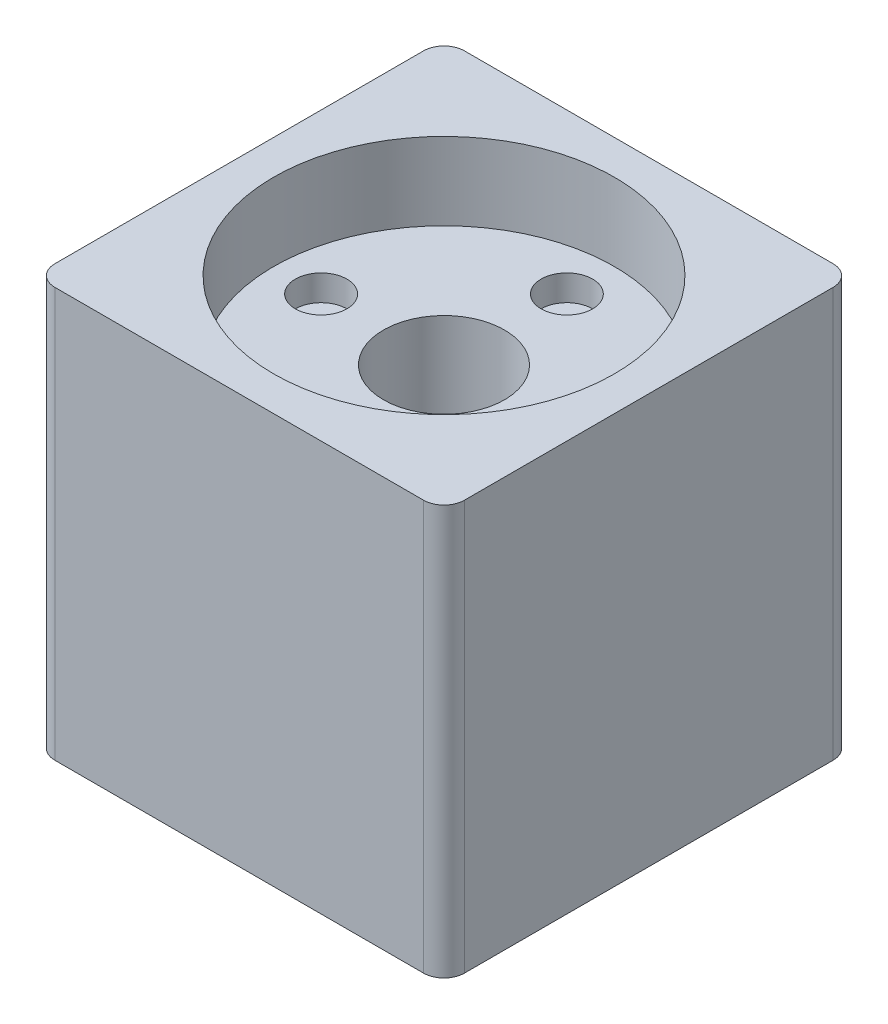
ISO-10303-21;
HEADER;
FILE_DESCRIPTION(('STEP AP214'),'2;1');
FILE_NAME('part.step','',(''),(''),'','','');
FILE_SCHEMA(('AUTOMOTIVE_DESIGN { 1 0 10303 214 1 1 1 1 }'));
ENDSEC;
DATA;
#1=APPLICATION_CONTEXT('core data for automotive mechanical design processes');
#2=APPLICATION_PROTOCOL_DEFINITION('international standard','automotive_design',2000,#1);
#3=PRODUCT_CONTEXT('',#1,'mechanical');
#4=PRODUCT('Part','Part','',(#3));
#5=PRODUCT_RELATED_PRODUCT_CATEGORY('part','',(#4));
#6=PRODUCT_DEFINITION_FORMATION('','',#4);
#7=PRODUCT_DEFINITION_CONTEXT('part definition',#1,'design');
#8=PRODUCT_DEFINITION('design','',#6,#7);
#9=PRODUCT_DEFINITION_SHAPE('','',#8);
#10=(LENGTH_UNIT() NAMED_UNIT(*) SI_UNIT(.MILLI.,.METRE.));
#11=(NAMED_UNIT(*) PLANE_ANGLE_UNIT() SI_UNIT($,.RADIAN.));
#12=(NAMED_UNIT(*) SI_UNIT($,.STERADIAN.) SOLID_ANGLE_UNIT());
#13=UNCERTAINTY_MEASURE_WITH_UNIT(LENGTH_MEASURE(1.E-05),#10,'distance_accuracy_value','');
#14=(GEOMETRIC_REPRESENTATION_CONTEXT(3) GLOBAL_UNCERTAINTY_ASSIGNED_CONTEXT((#13)) GLOBAL_UNIT_ASSIGNED_CONTEXT((#10,
#11,#12)) REPRESENTATION_CONTEXT('',''));
#15=CARTESIAN_POINT('',(0.,0.,0.));
#16=DIRECTION('',(0.,0.,1.));
#17=DIRECTION('',(1.,0.,0.));
#18=AXIS2_PLACEMENT_3D('',#15,#16,#17);
#19=CARTESIAN_POINT('',(0.,7.9375,0.));
#20=DIRECTION('',(0.,-1.,0.));
#21=DIRECTION('',(0.,0.,-1.));
#22=AXIS2_PLACEMENT_3D('',#19,#20,#21);
#23=CYLINDRICAL_SURFACE('',#22,2.34506403026729);
#24=CARTESIAN_POINT('',(0.,-7.9375,0.));
#25=DIRECTION('',(0.,1.,0.));
#26=DIRECTION('',(0.,0.,1.));
#27=AXIS2_PLACEMENT_3D('',#24,#25,#26);
#28=CIRCLE('',#27,2.34506403026729);
#29=CARTESIAN_POINT('',(0.,-7.9375,2.34506403026729));
#30=VERTEX_POINT('',#29);
#31=EDGE_CURVE('E126',#30,#30,#28,.T.);
#32=ORIENTED_EDGE('',*,*,#31,.F.);
#33=EDGE_LOOP('',(#32));
#34=FACE_BOUND('',#33,.T.);
#35=CARTESIAN_POINT('',(0.,4.9375,0.));
#36=DIRECTION('',(0.,1.,0.));
#37=DIRECTION('',(0.,0.,1.));
#38=AXIS2_PLACEMENT_3D('',#35,#36,#37);
#39=CIRCLE('',#38,2.34506403026729);
#40=CARTESIAN_POINT('',(0.,4.9375,2.34506403026729));
#41=VERTEX_POINT('',#40);
#42=EDGE_CURVE('E132',#41,#41,#39,.T.);
#43=ORIENTED_EDGE('',*,*,#42,.T.);
#44=EDGE_LOOP('',(#43));
#45=FACE_BOUND('',#44,.T.);
#46=ADVANCED_FACE('F33',(#34,#45),#23,.F.);
#47=CARTESIAN_POINT('',(0.,7.9375,0.));
#48=DIRECTION('',(0.,-1.,0.));
#49=DIRECTION('',(0.,0.,-1.));
#50=AXIS2_PLACEMENT_3D('',#47,#48,#49);
#51=PLANE('',#50);
#52=CARTESIAN_POINT('',(0.,7.9375,0.));
#53=DIRECTION('',(0.,1.,0.));
#54=DIRECTION('',(0.,0.,1.));
#55=AXIS2_PLACEMENT_3D('',#52,#53,#54);
#56=CIRCLE('',#55,6.604);
#57=CARTESIAN_POINT('',(0.,7.9375,6.604));
#58=VERTEX_POINT('',#57);
#59=EDGE_CURVE('E181',#58,#58,#56,.T.);
#60=ORIENTED_EDGE('',*,*,#59,.F.);
#61=EDGE_LOOP('',(#60));
#62=FACE_BOUND('',#61,.T.);
#63=DIRECTION('',(1.,0.,0.));
#64=VECTOR('',#63,1.);
#65=CARTESIAN_POINT('',(-7.9375,7.9375,7.9375));
#66=LINE('',#65,#64);
#67=CARTESIAN_POINT('',(-7.14375,7.9375,7.9375));
#68=VERTEX_POINT('',#67);
#69=CARTESIAN_POINT('',(7.14375,7.9375,7.9375));
#70=VERTEX_POINT('',#69);
#71=EDGE_CURVE('E135',#68,#70,#66,.T.);
#72=ORIENTED_EDGE('',*,*,#71,.T.);
#73=CARTESIAN_POINT('',(7.14375,7.9375,7.14375));
#74=DIRECTION('',(0.,-1.,0.));
#75=DIRECTION('',(0.,0.,-1.));
#76=AXIS2_PLACEMENT_3D('',#73,#74,#75);
#77=CIRCLE('',#76,0.79375);
#78=CARTESIAN_POINT('',(7.9375,7.9375,7.14375));
#79=VERTEX_POINT('',#78);
#80=EDGE_CURVE('E157',#70,#79,#77,.F.);
#81=ORIENTED_EDGE('',*,*,#80,.T.);
#82=DIRECTION('',(0.,0.,-1.));
#83=VECTOR('',#82,1.);
#84=CARTESIAN_POINT('',(7.9375,7.9375,7.9375));
#85=LINE('',#84,#83);
#86=CARTESIAN_POINT('',(7.9375,7.9375,-7.14375));
#87=VERTEX_POINT('',#86);
#88=EDGE_CURVE('E118',#79,#87,#85,.T.);
#89=ORIENTED_EDGE('',*,*,#88,.T.);
#90=CARTESIAN_POINT('',(7.14375,7.9375,-7.14375));
#91=DIRECTION('',(0.,-1.,0.));
#92=DIRECTION('',(0.,0.,-1.));
#93=AXIS2_PLACEMENT_3D('',#90,#91,#92);
#94=CIRCLE('',#93,0.79375);
#95=CARTESIAN_POINT('',(7.14375,7.9375,-7.9375));
#96=VERTEX_POINT('',#95);
#97=EDGE_CURVE('E155',#87,#96,#94,.F.);
#98=ORIENTED_EDGE('',*,*,#97,.T.);
#99=DIRECTION('',(-1.,0.,0.));
#100=VECTOR('',#99,1.);
#101=CARTESIAN_POINT('',(-7.9375,7.9375,-7.9375));
#102=LINE('',#101,#100);
#103=CARTESIAN_POINT('',(-7.14375,7.9375,-7.9375));
#104=VERTEX_POINT('',#103);
#105=EDGE_CURVE('E177',#96,#104,#102,.T.);
#106=ORIENTED_EDGE('',*,*,#105,.T.);
#107=CARTESIAN_POINT('',(-7.14375,7.9375,-7.14375));
#108=DIRECTION('',(0.,-1.,0.));
#109=DIRECTION('',(0.,0.,-1.));
#110=AXIS2_PLACEMENT_3D('',#107,#108,#109);
#111=CIRCLE('',#110,0.79375);
#112=CARTESIAN_POINT('',(-7.9375,7.9375,-7.14375));
#113=VERTEX_POINT('',#112);
#114=EDGE_CURVE('E53',#104,#113,#111,.F.);
#115=ORIENTED_EDGE('',*,*,#114,.T.);
#116=DIRECTION('',(0.,0.,1.));
#117=VECTOR('',#116,1.);
#118=CARTESIAN_POINT('',(-7.9375,7.9375,7.9375));
#119=LINE('',#118,#117);
#120=CARTESIAN_POINT('',(-7.9375,7.9375,7.14375));
#121=VERTEX_POINT('',#120);
#122=EDGE_CURVE('E167',#113,#121,#119,.T.);
#123=ORIENTED_EDGE('',*,*,#122,.T.);
#124=CARTESIAN_POINT('',(-7.14375,7.9375,7.14375));
#125=DIRECTION('',(0.,-1.,0.));
#126=DIRECTION('',(0.,0.,-1.));
#127=AXIS2_PLACEMENT_3D('',#124,#125,#126);
#128=CIRCLE('',#127,0.79375);
#129=EDGE_CURVE('E153',#121,#68,#128,.F.);
#130=ORIENTED_EDGE('',*,*,#129,.T.);
#131=EDGE_LOOP('',(#72,#81,#89,#98,#106,#115,#123,#130));
#132=FACE_BOUND('',#131,.T.);
#133=ADVANCED_FACE('F241',(#62,#132),#51,.F.);
#134=CARTESIAN_POINT('',(0.,-7.9375,0.));
#135=DIRECTION('',(0.,-1.,0.));
#136=DIRECTION('',(0.,0.,-1.));
#137=AXIS2_PLACEMENT_3D('',#134,#135,#136);
#138=PLANE('',#137);
#139=DIRECTION('',(0.,0.,-1.));
#140=VECTOR('',#139,1.);
#141=CARTESIAN_POINT('',(7.9375,-7.9375,7.9375));
#142=LINE('',#141,#140);
#143=CARTESIAN_POINT('',(7.9375,-7.9375,7.14375));
#144=VERTEX_POINT('',#143);
#145=CARTESIAN_POINT('',(7.9375,-7.9375,-7.14375));
#146=VERTEX_POINT('',#145);
#147=EDGE_CURVE('E115',#144,#146,#142,.T.);
#148=ORIENTED_EDGE('',*,*,#147,.F.);
#149=CARTESIAN_POINT('',(7.14375,-7.9375,7.14375));
#150=DIRECTION('',(0.,-1.,0.));
#151=DIRECTION('',(0.,0.,-1.));
#152=AXIS2_PLACEMENT_3D('',#149,#150,#151);
#153=CIRCLE('',#152,0.79375);
#154=CARTESIAN_POINT('',(7.14375,-7.9375,7.9375));
#155=VERTEX_POINT('',#154);
#156=EDGE_CURVE('E98',#144,#155,#153,.T.);
#157=ORIENTED_EDGE('',*,*,#156,.T.);
#158=DIRECTION('',(1.,0.,0.));
#159=VECTOR('',#158,1.);
#160=CARTESIAN_POINT('',(-7.9375,-7.9375,7.9375));
#161=LINE('',#160,#159);
#162=CARTESIAN_POINT('',(-7.14375,-7.9375,7.9375));
#163=VERTEX_POINT('',#162);
#164=EDGE_CURVE('E139',#163,#155,#161,.T.);
#165=ORIENTED_EDGE('',*,*,#164,.F.);
#166=CARTESIAN_POINT('',(-7.14375,-7.9375,7.14375));
#167=DIRECTION('',(0.,-1.,0.));
#168=DIRECTION('',(0.,0.,-1.));
#169=AXIS2_PLACEMENT_3D('',#166,#167,#168);
#170=CIRCLE('',#169,0.79375);
#171=CARTESIAN_POINT('',(-7.9375,-7.9375,7.14375));
#172=VERTEX_POINT('',#171);
#173=EDGE_CURVE('E146',#163,#172,#170,.T.);
#174=ORIENTED_EDGE('',*,*,#173,.T.);
#175=DIRECTION('',(0.,0.,1.));
#176=VECTOR('',#175,1.);
#177=CARTESIAN_POINT('',(-7.9375,-7.9375,7.9375));
#178=LINE('',#177,#176);
#179=CARTESIAN_POINT('',(-7.9375,-7.9375,-7.14375));
#180=VERTEX_POINT('',#179);
#181=EDGE_CURVE('E129',#180,#172,#178,.T.);
#182=ORIENTED_EDGE('',*,*,#181,.F.);
#183=CARTESIAN_POINT('',(-7.14375,-7.9375,-7.14375));
#184=DIRECTION('',(0.,-1.,0.));
#185=DIRECTION('',(0.,0.,-1.));
#186=AXIS2_PLACEMENT_3D('',#183,#184,#185);
#187=CIRCLE('',#186,0.79375);
#188=CARTESIAN_POINT('',(-7.14375,-7.9375,-7.9375));
#189=VERTEX_POINT('',#188);
#190=EDGE_CURVE('E119',#180,#189,#187,.T.);
#191=ORIENTED_EDGE('',*,*,#190,.T.);
#192=DIRECTION('',(-1.,0.,0.));
#193=VECTOR('',#192,1.);
#194=CARTESIAN_POINT('',(-7.9375,-7.9375,-7.9375));
#195=LINE('',#194,#193);
#196=CARTESIAN_POINT('',(7.14375,-7.9375,-7.9375));
#197=VERTEX_POINT('',#196);
#198=EDGE_CURVE('E125',#197,#189,#195,.T.);
#199=ORIENTED_EDGE('',*,*,#198,.F.);
#200=CARTESIAN_POINT('',(7.14375,-7.9375,-7.14375));
#201=DIRECTION('',(0.,-1.,0.));
#202=DIRECTION('',(0.,0.,-1.));
#203=AXIS2_PLACEMENT_3D('',#200,#201,#202);
#204=CIRCLE('',#203,0.79375);
#205=EDGE_CURVE('E109',#197,#146,#204,.T.);
#206=ORIENTED_EDGE('',*,*,#205,.T.);
#207=EDGE_LOOP('',(#148,#157,#165,#174,#182,#191,#199,#206));
#208=FACE_BOUND('',#207,.T.);
#209=ORIENTED_EDGE('',*,*,#31,.T.);
#210=EDGE_LOOP('',(#209));
#211=FACE_BOUND('',#210,.T.);
#212=ADVANCED_FACE('F122',(#208,#211),#138,.T.);
#213=CARTESIAN_POINT('',(7.9375,7.9375,7.9375));
#214=DIRECTION('',(-1.,0.,0.));
#215=DIRECTION('',(0.,0.,1.));
#216=AXIS2_PLACEMENT_3D('',#213,#214,#215);
#217=PLANE('',#216);
#218=ORIENTED_EDGE('',*,*,#88,.F.);
#219=DIRECTION('',(0.,-1.,0.));
#220=VECTOR('',#219,1.);
#221=CARTESIAN_POINT('',(7.9375,7.9375,7.14375));
#222=LINE('',#221,#220);
#223=EDGE_CURVE('E102',#79,#144,#222,.T.);
#224=ORIENTED_EDGE('',*,*,#223,.T.);
#225=ORIENTED_EDGE('',*,*,#147,.T.);
#226=DIRECTION('',(0.,-1.,0.));
#227=VECTOR('',#226,1.);
#228=CARTESIAN_POINT('',(7.9375,7.9375,-7.14375));
#229=LINE('',#228,#227);
#230=EDGE_CURVE('E120',#146,#87,#229,.F.);
#231=ORIENTED_EDGE('',*,*,#230,.T.);
#232=EDGE_LOOP('',(#218,#224,#225,#231));
#233=FACE_BOUND('',#232,.T.);
#234=ADVANCED_FACE('F114',(#233),#217,.F.);
#235=CARTESIAN_POINT('',(-7.9375,7.9375,-7.9375));
#236=DIRECTION('',(0.,0.,1.));
#237=DIRECTION('',(1.,0.,0.));
#238=AXIS2_PLACEMENT_3D('',#235,#236,#237);
#239=PLANE('',#238);
#240=ORIENTED_EDGE('',*,*,#105,.F.);
#241=DIRECTION('',(0.,-1.,0.));
#242=VECTOR('',#241,1.);
#243=CARTESIAN_POINT('',(7.14375,7.9375,-7.9375));
#244=LINE('',#243,#242);
#245=EDGE_CURVE('E161',#96,#197,#244,.T.);
#246=ORIENTED_EDGE('',*,*,#245,.T.);
#247=ORIENTED_EDGE('',*,*,#198,.T.);
#248=DIRECTION('',(0.,-1.,0.));
#249=VECTOR('',#248,1.);
#250=CARTESIAN_POINT('',(-7.14375,7.9375,-7.9375));
#251=LINE('',#250,#249);
#252=EDGE_CURVE('E159',#189,#104,#251,.F.);
#253=ORIENTED_EDGE('',*,*,#252,.T.);
#254=EDGE_LOOP('',(#240,#246,#247,#253));
#255=FACE_BOUND('',#254,.T.);
#256=ADVANCED_FACE('F256',(#255),#239,.F.);
#257=CARTESIAN_POINT('',(-7.9375,7.9375,7.9375));
#258=DIRECTION('',(1.,0.,0.));
#259=DIRECTION('',(0.,0.,-1.));
#260=AXIS2_PLACEMENT_3D('',#257,#258,#259);
#261=PLANE('',#260);
#262=ORIENTED_EDGE('',*,*,#181,.T.);
#263=DIRECTION('',(0.,-1.,0.));
#264=VECTOR('',#263,1.);
#265=CARTESIAN_POINT('',(-7.9375,7.9375,7.14375));
#266=LINE('',#265,#264);
#267=EDGE_CURVE('E11',#172,#121,#266,.F.);
#268=ORIENTED_EDGE('',*,*,#267,.T.);
#269=ORIENTED_EDGE('',*,*,#122,.F.);
#270=DIRECTION('',(0.,-1.,0.));
#271=VECTOR('',#270,1.);
#272=CARTESIAN_POINT('',(-7.9375,7.9375,-7.14375));
#273=LINE('',#272,#271);
#274=EDGE_CURVE('E41',#113,#180,#273,.T.);
#275=ORIENTED_EDGE('',*,*,#274,.T.);
#276=EDGE_LOOP('',(#262,#268,#269,#275));
#277=FACE_BOUND('',#276,.T.);
#278=ADVANCED_FACE('F166',(#277),#261,.F.);
#279=CARTESIAN_POINT('',(-7.9375,7.9375,7.9375));
#280=DIRECTION('',(0.,0.,-1.));
#281=DIRECTION('',(-1.,0.,0.));
#282=AXIS2_PLACEMENT_3D('',#279,#280,#281);
#283=PLANE('',#282);
#284=ORIENTED_EDGE('',*,*,#164,.T.);
#285=DIRECTION('',(0.,-1.,0.));
#286=VECTOR('',#285,1.);
#287=CARTESIAN_POINT('',(7.14375,7.9375,7.9375));
#288=LINE('',#287,#286);
#289=EDGE_CURVE('E103',#155,#70,#288,.F.);
#290=ORIENTED_EDGE('',*,*,#289,.T.);
#291=ORIENTED_EDGE('',*,*,#71,.F.);
#292=DIRECTION('',(0.,-1.,0.));
#293=VECTOR('',#292,1.);
#294=CARTESIAN_POINT('',(-7.14375,7.9375,7.9375));
#295=LINE('',#294,#293);
#296=EDGE_CURVE('E108',#68,#163,#295,.T.);
#297=ORIENTED_EDGE('',*,*,#296,.T.);
#298=EDGE_LOOP('',(#284,#290,#291,#297));
#299=FACE_BOUND('',#298,.T.);
#300=ADVANCED_FACE('F175',(#299),#283,.F.);
#301=CARTESIAN_POINT('',(0.,4.9375,0.));
#302=DIRECTION('',(0.,1.,0.));
#303=DIRECTION('',(0.,0.,1.));
#304=AXIS2_PLACEMENT_3D('',#301,#302,#303);
#305=CYLINDRICAL_SURFACE('',#304,6.604);
#306=CARTESIAN_POINT('',(0.,4.9375,0.));
#307=DIRECTION('',(0.,1.,0.));
#308=DIRECTION('',(0.,0.,1.));
#309=AXIS2_PLACEMENT_3D('',#306,#307,#308);
#310=CIRCLE('',#309,6.604);
#311=CARTESIAN_POINT('',(0.,4.9375,6.604));
#312=VERTEX_POINT('',#311);
#313=EDGE_CURVE('E143',#312,#312,#310,.T.);
#314=ORIENTED_EDGE('',*,*,#313,.F.);
#315=EDGE_LOOP('',(#314));
#316=FACE_BOUND('',#315,.T.);
#317=ORIENTED_EDGE('',*,*,#59,.T.);
#318=EDGE_LOOP('',(#317));
#319=FACE_BOUND('',#318,.T.);
#320=ADVANCED_FACE('F224',(#316,#319),#305,.F.);
#321=CARTESIAN_POINT('',(0.,4.9375,0.));
#322=DIRECTION('',(0.,1.,0.));
#323=DIRECTION('',(0.,0.,1.));
#324=AXIS2_PLACEMENT_3D('',#321,#322,#323);
#325=PLANE('',#324);
#326=CARTESIAN_POINT('',(0.,4.9375,4.7625));
#327=DIRECTION('',(0.,1.,0.));
#328=DIRECTION('',(1.,0.,0.));
#329=AXIS2_PLACEMENT_3D('',#326,#327,#328);
#330=CIRCLE('',#329,1.);
#331=CARTESIAN_POINT('',(1.00000000000002,4.9375,4.7625));
#332=VERTEX_POINT('',#331);
#333=EDGE_CURVE('E205',#332,#332,#330,.T.);
#334=ORIENTED_EDGE('',*,*,#333,.F.);
#335=EDGE_LOOP('',(#334));
#336=FACE_BOUND('',#335,.T.);
#337=CARTESIAN_POINT('',(4.7625,4.9375,0.));
#338=DIRECTION('',(0.,1.,0.));
#339=DIRECTION('',(0.,0.,-1.));
#340=AXIS2_PLACEMENT_3D('',#337,#338,#339);
#341=CIRCLE('',#340,1.);
#342=CARTESIAN_POINT('',(4.7625,4.9375,-1.));
#343=VERTEX_POINT('',#342);
#344=EDGE_CURVE('E199',#343,#343,#341,.T.);
#345=ORIENTED_EDGE('',*,*,#344,.F.);
#346=EDGE_LOOP('',(#345));
#347=FACE_BOUND('',#346,.T.);
#348=CARTESIAN_POINT('',(0.,4.9375,-4.7625));
#349=DIRECTION('',(0.,1.,0.));
#350=DIRECTION('',(-1.,0.,0.));
#351=AXIS2_PLACEMENT_3D('',#348,#349,#350);
#352=CIRCLE('',#351,1.);
#353=CARTESIAN_POINT('',(-1.00000000000005,4.9375,-4.76249999999999));
#354=VERTEX_POINT('',#353);
#355=EDGE_CURVE('E193',#354,#354,#352,.T.);
#356=ORIENTED_EDGE('',*,*,#355,.F.);
#357=EDGE_LOOP('',(#356));
#358=FACE_BOUND('',#357,.T.);
#359=CARTESIAN_POINT('',(-4.7625,4.9375,0.));
#360=DIRECTION('',(0.,1.,0.));
#361=DIRECTION('',(0.,0.,1.));
#362=AXIS2_PLACEMENT_3D('',#359,#360,#361);
#363=CIRCLE('',#362,1.);
#364=CARTESIAN_POINT('',(-4.7625,4.9375,1.));
#365=VERTEX_POINT('',#364);
#366=EDGE_CURVE('E187',#365,#365,#363,.T.);
#367=ORIENTED_EDGE('',*,*,#366,.F.);
#368=EDGE_LOOP('',(#367));
#369=FACE_BOUND('',#368,.T.);
#370=ORIENTED_EDGE('',*,*,#42,.F.);
#371=EDGE_LOOP('',(#370));
#372=FACE_BOUND('',#371,.T.);
#373=ORIENTED_EDGE('',*,*,#313,.T.);
#374=EDGE_LOOP('',(#373));
#375=FACE_BOUND('',#374,.T.);
#376=ADVANCED_FACE('F220',(#336,#347,#358,#369,#372,#375),#325,.T.);
#377=CARTESIAN_POINT('',(-4.7625,3.9375,0.));
#378=DIRECTION('',(0.,1.,0.));
#379=DIRECTION('',(0.,0.,1.));
#380=AXIS2_PLACEMENT_3D('',#377,#378,#379);
#381=CYLINDRICAL_SURFACE('',#380,1.);
#382=CARTESIAN_POINT('',(-4.7625,3.9375,0.));
#383=DIRECTION('',(0.,1.,0.));
#384=DIRECTION('',(0.,0.,1.));
#385=AXIS2_PLACEMENT_3D('',#382,#383,#384);
#386=CIRCLE('',#385,1.);
#387=CARTESIAN_POINT('',(-4.7625,3.9375,1.));
#388=VERTEX_POINT('',#387);
#389=EDGE_CURVE('E184',#388,#388,#386,.T.);
#390=ORIENTED_EDGE('',*,*,#389,.F.);
#391=EDGE_LOOP('',(#390));
#392=FACE_BOUND('',#391,.T.);
#393=ORIENTED_EDGE('',*,*,#366,.T.);
#394=EDGE_LOOP('',(#393));
#395=FACE_BOUND('',#394,.T.);
#396=ADVANCED_FACE('F223',(#392,#395),#381,.F.);
#397=CARTESIAN_POINT('',(-4.7625,3.9375,0.));
#398=DIRECTION('',(0.,1.,0.));
#399=DIRECTION('',(0.,0.,1.));
#400=AXIS2_PLACEMENT_3D('',#397,#398,#399);
#401=PLANE('',#400);
#402=ORIENTED_EDGE('',*,*,#389,.T.);
#403=EDGE_LOOP('',(#402));
#404=FACE_BOUND('',#403,.T.);
#405=ADVANCED_FACE('F265',(#404),#401,.T.);
#406=CARTESIAN_POINT('',(7.14375,7.9375,7.14375));
#407=DIRECTION('',(0.,-1.,0.));
#408=DIRECTION('',(0.,0.,-1.));
#409=AXIS2_PLACEMENT_3D('',#406,#407,#408);
#410=CYLINDRICAL_SURFACE('',#409,0.79375);
#411=ORIENTED_EDGE('',*,*,#80,.F.);
#412=ORIENTED_EDGE('',*,*,#289,.F.);
#413=ORIENTED_EDGE('',*,*,#156,.F.);
#414=ORIENTED_EDGE('',*,*,#223,.F.);
#415=EDGE_LOOP('',(#411,#412,#413,#414));
#416=FACE_BOUND('',#415,.T.);
#417=ADVANCED_FACE('F101',(#416),#410,.T.);
#418=CARTESIAN_POINT('',(7.14375,7.9375,-7.14375));
#419=DIRECTION('',(0.,-1.,0.));
#420=DIRECTION('',(0.,0.,-1.));
#421=AXIS2_PLACEMENT_3D('',#418,#419,#420);
#422=CYLINDRICAL_SURFACE('',#421,0.79375);
#423=ORIENTED_EDGE('',*,*,#97,.F.);
#424=ORIENTED_EDGE('',*,*,#230,.F.);
#425=ORIENTED_EDGE('',*,*,#205,.F.);
#426=ORIENTED_EDGE('',*,*,#245,.F.);
#427=EDGE_LOOP('',(#423,#424,#425,#426));
#428=FACE_BOUND('',#427,.T.);
#429=ADVANCED_FACE('F264',(#428),#422,.T.);
#430=CARTESIAN_POINT('',(-7.14375,7.9375,7.14375));
#431=DIRECTION('',(0.,-1.,0.));
#432=DIRECTION('',(0.,0.,-1.));
#433=AXIS2_PLACEMENT_3D('',#430,#431,#432);
#434=CYLINDRICAL_SURFACE('',#433,0.79375);
#435=ORIENTED_EDGE('',*,*,#129,.F.);
#436=ORIENTED_EDGE('',*,*,#267,.F.);
#437=ORIENTED_EDGE('',*,*,#173,.F.);
#438=ORIENTED_EDGE('',*,*,#296,.F.);
#439=EDGE_LOOP('',(#435,#436,#437,#438));
#440=FACE_BOUND('',#439,.T.);
#441=ADVANCED_FACE('F172',(#440),#434,.T.);
#442=CARTESIAN_POINT('',(-7.14375,7.9375,-7.14375));
#443=DIRECTION('',(0.,-1.,0.));
#444=DIRECTION('',(0.,0.,-1.));
#445=AXIS2_PLACEMENT_3D('',#442,#443,#444);
#446=CYLINDRICAL_SURFACE('',#445,0.79375);
#447=ORIENTED_EDGE('',*,*,#114,.F.);
#448=ORIENTED_EDGE('',*,*,#252,.F.);
#449=ORIENTED_EDGE('',*,*,#190,.F.);
#450=ORIENTED_EDGE('',*,*,#274,.F.);
#451=EDGE_LOOP('',(#447,#448,#449,#450));
#452=FACE_BOUND('',#451,.T.);
#453=ADVANCED_FACE('F35',(#452),#446,.T.);
#454=CARTESIAN_POINT('',(0.,3.9375,-4.7625));
#455=DIRECTION('',(0.,1.,0.));
#456=DIRECTION('',(0.,0.,1.));
#457=AXIS2_PLACEMENT_3D('',#454,#455,#456);
#458=CYLINDRICAL_SURFACE('',#457,1.);
#459=CARTESIAN_POINT('',(0.,3.9375,-4.7625));
#460=DIRECTION('',(0.,1.,0.));
#461=DIRECTION('',(-1.,0.,0.));
#462=AXIS2_PLACEMENT_3D('',#459,#460,#461);
#463=CIRCLE('',#462,1.);
#464=CARTESIAN_POINT('',(-1.00000000000005,3.9375,-4.76249999999999));
#465=VERTEX_POINT('',#464);
#466=EDGE_CURVE('E196',#465,#465,#463,.T.);
#467=ORIENTED_EDGE('',*,*,#466,.F.);
#468=EDGE_LOOP('',(#467));
#469=FACE_BOUND('',#468,.T.);
#470=ORIENTED_EDGE('',*,*,#355,.T.);
#471=EDGE_LOOP('',(#470));
#472=FACE_BOUND('',#471,.T.);
#473=ADVANCED_FACE('F272',(#469,#472),#458,.F.);
#474=CARTESIAN_POINT('',(0.,3.9375,-4.7625));
#475=DIRECTION('',(0.,1.,0.));
#476=DIRECTION('',(-1.,0.,0.));
#477=AXIS2_PLACEMENT_3D('',#474,#475,#476);
#478=PLANE('',#477);
#479=ORIENTED_EDGE('',*,*,#466,.T.);
#480=EDGE_LOOP('',(#479));
#481=FACE_BOUND('',#480,.T.);
#482=ADVANCED_FACE('F276',(#481),#478,.T.);
#483=CARTESIAN_POINT('',(4.7625,3.9375,0.));
#484=DIRECTION('',(0.,1.,0.));
#485=DIRECTION('',(0.,0.,1.));
#486=AXIS2_PLACEMENT_3D('',#483,#484,#485);
#487=CYLINDRICAL_SURFACE('',#486,1.);
#488=CARTESIAN_POINT('',(4.7625,3.9375,0.));
#489=DIRECTION('',(0.,1.,0.));
#490=DIRECTION('',(0.,0.,-1.));
#491=AXIS2_PLACEMENT_3D('',#488,#489,#490);
#492=CIRCLE('',#491,1.);
#493=CARTESIAN_POINT('',(4.7625,3.9375,-1.));
#494=VERTEX_POINT('',#493);
#495=EDGE_CURVE('E202',#494,#494,#492,.T.);
#496=ORIENTED_EDGE('',*,*,#495,.F.);
#497=EDGE_LOOP('',(#496));
#498=FACE_BOUND('',#497,.T.);
#499=ORIENTED_EDGE('',*,*,#344,.T.);
#500=EDGE_LOOP('',(#499));
#501=FACE_BOUND('',#500,.T.);
#502=ADVANCED_FACE('F286',(#498,#501),#487,.F.);
#503=CARTESIAN_POINT('',(4.7625,3.9375,0.));
#504=DIRECTION('',(0.,1.,0.));
#505=DIRECTION('',(0.,0.,-1.));
#506=AXIS2_PLACEMENT_3D('',#503,#504,#505);
#507=PLANE('',#506);
#508=ORIENTED_EDGE('',*,*,#495,.T.);
#509=EDGE_LOOP('',(#508));
#510=FACE_BOUND('',#509,.T.);
#511=ADVANCED_FACE('F216',(#510),#507,.T.);
#512=CARTESIAN_POINT('',(0.,3.9375,4.7625));
#513=DIRECTION('',(0.,1.,0.));
#514=DIRECTION('',(0.,0.,1.));
#515=AXIS2_PLACEMENT_3D('',#512,#513,#514);
#516=CYLINDRICAL_SURFACE('',#515,1.);
#517=CARTESIAN_POINT('',(0.,3.9375,4.7625));
#518=DIRECTION('',(0.,1.,0.));
#519=DIRECTION('',(1.,0.,0.));
#520=AXIS2_PLACEMENT_3D('',#517,#518,#519);
#521=CIRCLE('',#520,1.);
#522=CARTESIAN_POINT('',(1.00000000000002,3.9375,4.7625));
#523=VERTEX_POINT('',#522);
#524=EDGE_CURVE('E190',#523,#523,#521,.T.);
#525=ORIENTED_EDGE('',*,*,#524,.F.);
#526=EDGE_LOOP('',(#525));
#527=FACE_BOUND('',#526,.T.);
#528=ORIENTED_EDGE('',*,*,#333,.T.);
#529=EDGE_LOOP('',(#528));
#530=FACE_BOUND('',#529,.T.);
#531=ADVANCED_FACE('F213',(#527,#530),#516,.F.);
#532=CARTESIAN_POINT('',(0.,3.9375,4.7625));
#533=DIRECTION('',(0.,1.,0.));
#534=DIRECTION('',(1.,0.,0.));
#535=AXIS2_PLACEMENT_3D('',#532,#533,#534);
#536=PLANE('',#535);
#537=ORIENTED_EDGE('',*,*,#524,.T.);
#538=EDGE_LOOP('',(#537));
#539=FACE_BOUND('',#538,.T.);
#540=ADVANCED_FACE('F211',(#539),#536,.T.);
#541=CLOSED_SHELL('',(#46,#133,#212,#234,#256,#278,#300,#320,#376,#396,#405,#417,#429,#441,#453,
#473,#482,#502,#511,#531,#540));
#542=MANIFOLD_SOLID_BREP('B2',#541);
#543=ADVANCED_BREP_SHAPE_REPRESENTATION('',(#18,#542),#14);
#544=SHAPE_DEFINITION_REPRESENTATION(#9,#543);
ENDSEC;
END-ISO-10303-21;
